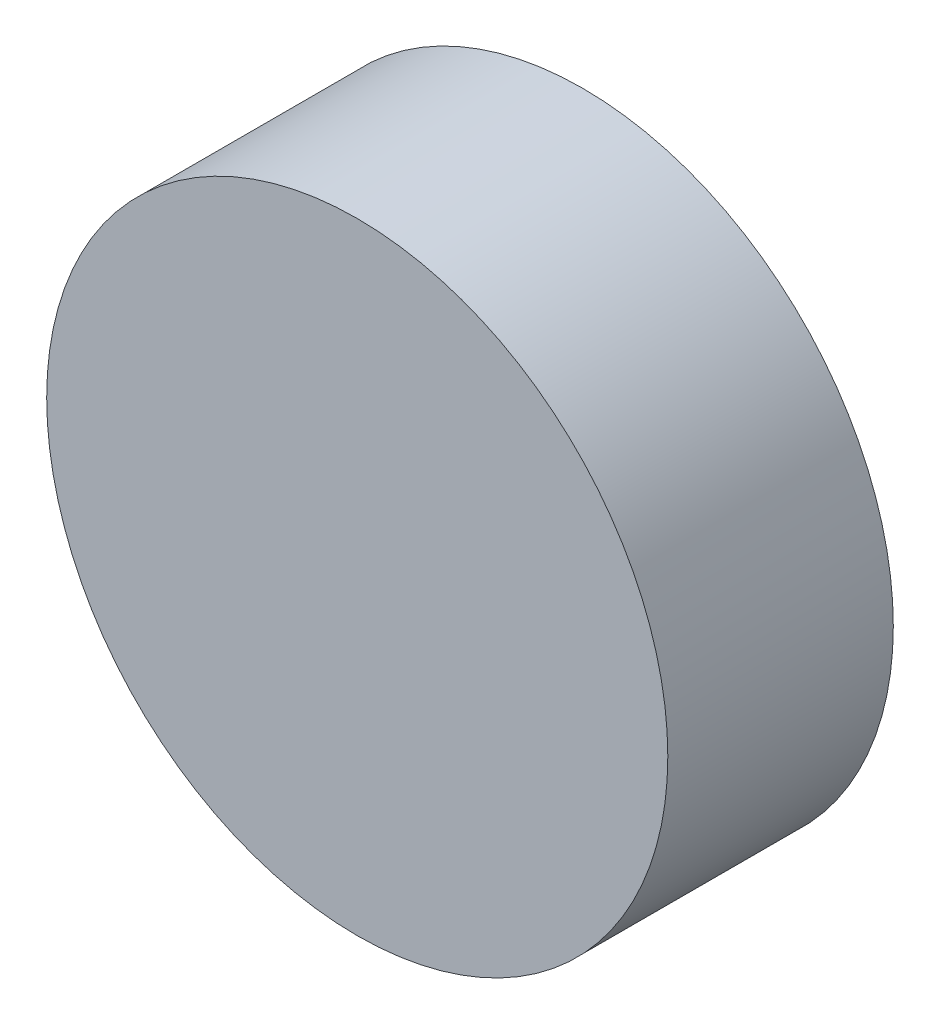
ISO-10303-21;
HEADER;
FILE_DESCRIPTION(('STEP AP214'),'2;1');
FILE_NAME('part.step','',(''),(''),'','','');
FILE_SCHEMA(('AUTOMOTIVE_DESIGN { 1 0 10303 214 1 1 1 1 }'));
ENDSEC;
DATA;
#1=APPLICATION_CONTEXT('core data for automotive mechanical design processes');
#2=APPLICATION_PROTOCOL_DEFINITION('international standard','automotive_design',2000,#1);
#3=PRODUCT_CONTEXT('',#1,'mechanical');
#4=PRODUCT('Part','Part','',(#3));
#5=PRODUCT_RELATED_PRODUCT_CATEGORY('part','',(#4));
#6=PRODUCT_DEFINITION_FORMATION('','',#4);
#7=PRODUCT_DEFINITION_CONTEXT('part definition',#1,'design');
#8=PRODUCT_DEFINITION('design','',#6,#7);
#9=PRODUCT_DEFINITION_SHAPE('','',#8);
#10=(LENGTH_UNIT() NAMED_UNIT(*) SI_UNIT(.MILLI.,.METRE.));
#11=(NAMED_UNIT(*) PLANE_ANGLE_UNIT() SI_UNIT($,.RADIAN.));
#12=(NAMED_UNIT(*) SI_UNIT($,.STERADIAN.) SOLID_ANGLE_UNIT());
#13=UNCERTAINTY_MEASURE_WITH_UNIT(LENGTH_MEASURE(1.E-05),#10,'distance_accuracy_value','');
#14=(GEOMETRIC_REPRESENTATION_CONTEXT(3) GLOBAL_UNCERTAINTY_ASSIGNED_CONTEXT((#13)) GLOBAL_UNIT_ASSIGNED_CONTEXT((#10,
#11,#12)) REPRESENTATION_CONTEXT('',''));
#15=CARTESIAN_POINT('',(0.,0.,0.));
#16=DIRECTION('',(0.,0.,1.));
#17=DIRECTION('',(1.,0.,0.));
#18=AXIS2_PLACEMENT_3D('',#15,#16,#17);
#19=CARTESIAN_POINT('',(0.,0.,16.7));
#20=DIRECTION('',(0.,0.,-1.));
#21=DIRECTION('',(-1.,0.,0.));
#22=AXIS2_PLACEMENT_3D('',#19,#20,#21);
#23=CYLINDRICAL_SURFACE('',#22,23.);
#24=CARTESIAN_POINT('',(0.,0.,16.7));
#25=DIRECTION('',(0.,0.,1.));
#26=DIRECTION('',(1.,0.,0.));
#27=AXIS2_PLACEMENT_3D('',#24,#25,#26);
#28=CIRCLE('',#27,23.);
#29=CARTESIAN_POINT('',(23.,0.,16.7));
#30=VERTEX_POINT('',#29);
#31=EDGE_CURVE('E10',#30,#30,#28,.T.);
#32=ORIENTED_EDGE('',*,*,#31,.F.);
#33=EDGE_LOOP('',(#32));
#34=FACE_BOUND('',#33,.T.);
#35=CARTESIAN_POINT('',(0.,0.,0.));
#36=DIRECTION('',(0.,0.,1.));
#37=DIRECTION('',(1.,0.,0.));
#38=AXIS2_PLACEMENT_3D('',#35,#36,#37);
#39=CIRCLE('',#38,23.);
#40=CARTESIAN_POINT('',(23.,0.,0.));
#41=VERTEX_POINT('',#40);
#42=EDGE_CURVE('E34',#41,#41,#39,.T.);
#43=ORIENTED_EDGE('',*,*,#42,.T.);
#44=EDGE_LOOP('',(#43));
#45=FACE_BOUND('',#44,.T.);
#46=ADVANCED_FACE('F31',(#34,#45),#23,.T.);
#47=CARTESIAN_POINT('',(0.,0.,16.7));
#48=DIRECTION('',(0.,0.,1.));
#49=DIRECTION('',(1.,0.,0.));
#50=AXIS2_PLACEMENT_3D('',#47,#48,#49);
#51=PLANE('',#50);
#52=ORIENTED_EDGE('',*,*,#31,.T.);
#53=EDGE_LOOP('',(#52));
#54=FACE_BOUND('',#53,.T.);
#55=ADVANCED_FACE('F46',(#54),#51,.T.);
#56=CARTESIAN_POINT('',(0.,0.,0.));
#57=DIRECTION('',(0.,0.,1.));
#58=DIRECTION('',(1.,0.,0.));
#59=AXIS2_PLACEMENT_3D('',#56,#57,#58);
#60=PLANE('',#59);
#61=ORIENTED_EDGE('',*,*,#42,.F.);
#62=EDGE_LOOP('',(#61));
#63=FACE_BOUND('',#62,.T.);
#64=ADVANCED_FACE('F44',(#63),#60,.F.);
#65=CLOSED_SHELL('',(#46,#55,#64));
#66=MANIFOLD_SOLID_BREP('B2',#65);
#67=ADVANCED_BREP_SHAPE_REPRESENTATION('',(#18,#66),#14);
#68=SHAPE_DEFINITION_REPRESENTATION(#9,#67);
ENDSEC;
END-ISO-10303-21;
